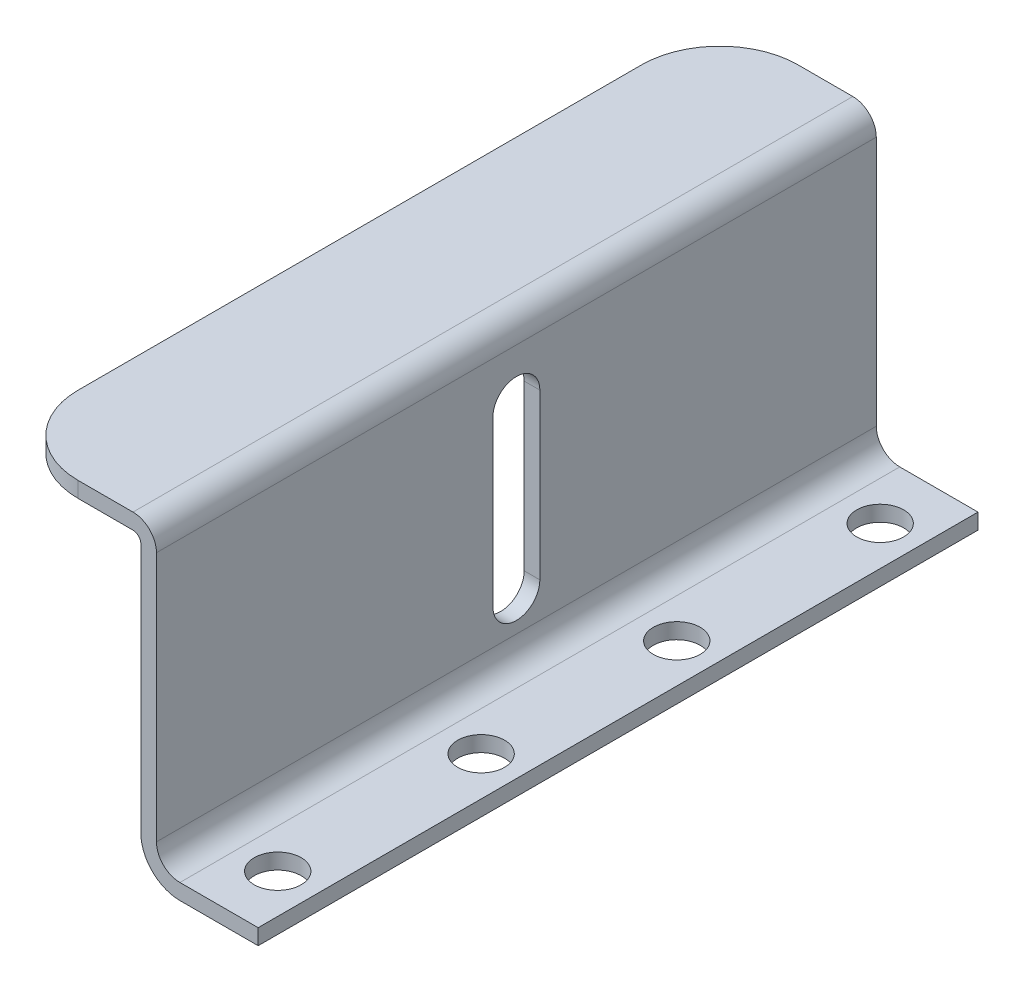
ISO-10303-21;
HEADER;
FILE_DESCRIPTION(('STEP AP214'),'2;1');
FILE_NAME('part.step','',(''),(''),'','','');
FILE_SCHEMA(('AUTOMOTIVE_DESIGN { 1 0 10303 214 1 1 1 1 }'));
ENDSEC;
DATA;
#1=APPLICATION_CONTEXT('core data for automotive mechanical design processes');
#2=APPLICATION_PROTOCOL_DEFINITION('international standard','automotive_design',2000,#1);
#3=PRODUCT_CONTEXT('',#1,'mechanical');
#4=PRODUCT('Part','Part','',(#3));
#5=PRODUCT_RELATED_PRODUCT_CATEGORY('part','',(#4));
#6=PRODUCT_DEFINITION_FORMATION('','',#4);
#7=PRODUCT_DEFINITION_CONTEXT('part definition',#1,'design');
#8=PRODUCT_DEFINITION('design','',#6,#7);
#9=PRODUCT_DEFINITION_SHAPE('','',#8);
#10=(LENGTH_UNIT() NAMED_UNIT(*) SI_UNIT(.MILLI.,.METRE.));
#11=(NAMED_UNIT(*) PLANE_ANGLE_UNIT() SI_UNIT($,.RADIAN.));
#12=(NAMED_UNIT(*) SI_UNIT($,.STERADIAN.) SOLID_ANGLE_UNIT());
#13=UNCERTAINTY_MEASURE_WITH_UNIT(LENGTH_MEASURE(1.E-05),#10,'distance_accuracy_value','');
#14=(GEOMETRIC_REPRESENTATION_CONTEXT(3) GLOBAL_UNCERTAINTY_ASSIGNED_CONTEXT((#13)) GLOBAL_UNIT_ASSIGNED_CONTEXT((#10,
#11,#12)) REPRESENTATION_CONTEXT('',''));
#15=CARTESIAN_POINT('',(0.,0.,0.));
#16=DIRECTION('',(0.,0.,1.));
#17=DIRECTION('',(1.,0.,0.));
#18=AXIS2_PLACEMENT_3D('',#15,#16,#17);
#19=CARTESIAN_POINT('',(7.31554939467241,-17.1473714116764,46.));
#20=DIRECTION('',(0.,1.,0.));
#21=DIRECTION('',(0.,0.,1.));
#22=AXIS2_PLACEMENT_3D('',#19,#20,#21);
#23=PLANE('',#22);
#24=CARTESIAN_POINT('',(12.3155493946724,-17.1473714116764,-38.5));
#25=DIRECTION('',(0.,1.,0.));
#26=DIRECTION('',(0.,0.,1.));
#27=AXIS2_PLACEMENT_3D('',#24,#25,#26);
#28=CIRCLE('',#27,3.);
#29=CARTESIAN_POINT('',(12.3155493946724,-17.1473714116764,-35.5));
#30=VERTEX_POINT('',#29);
#31=EDGE_CURVE('E196',#30,#30,#28,.T.);
#32=ORIENTED_EDGE('',*,*,#31,.T.);
#33=EDGE_LOOP('',(#32));
#34=FACE_BOUND('',#33,.T.);
#35=CARTESIAN_POINT('',(12.3155493946724,-17.1473714116764,-12.5));
#36=DIRECTION('',(0.,1.,0.));
#37=DIRECTION('',(0.,0.,1.));
#38=AXIS2_PLACEMENT_3D('',#35,#36,#37);
#39=CIRCLE('',#38,3.);
#40=CARTESIAN_POINT('',(12.3155493946724,-17.1473714116764,-9.5));
#41=VERTEX_POINT('',#40);
#42=EDGE_CURVE('E202',#41,#41,#39,.T.);
#43=ORIENTED_EDGE('',*,*,#42,.T.);
#44=EDGE_LOOP('',(#43));
#45=FACE_BOUND('',#44,.T.);
#46=CARTESIAN_POINT('',(12.3155493946724,-17.1473714116764,12.5));
#47=DIRECTION('',(0.,1.,0.));
#48=DIRECTION('',(0.,0.,1.));
#49=AXIS2_PLACEMENT_3D('',#46,#47,#48);
#50=CIRCLE('',#49,3.);
#51=CARTESIAN_POINT('',(12.3155493946724,-17.1473714116764,15.5));
#52=VERTEX_POINT('',#51);
#53=EDGE_CURVE('E208',#52,#52,#50,.T.);
#54=ORIENTED_EDGE('',*,*,#53,.T.);
#55=EDGE_LOOP('',(#54));
#56=FACE_BOUND('',#55,.T.);
#57=CARTESIAN_POINT('',(12.3155493946724,-17.1473714116764,38.5));
#58=DIRECTION('',(0.,1.,0.));
#59=DIRECTION('',(0.,0.,1.));
#60=AXIS2_PLACEMENT_3D('',#57,#58,#59);
#61=CIRCLE('',#60,3.);
#62=CARTESIAN_POINT('',(12.3155493946724,-17.1473714116764,41.5));
#63=VERTEX_POINT('',#62);
#64=EDGE_CURVE('E214',#63,#63,#61,.T.);
#65=ORIENTED_EDGE('',*,*,#64,.T.);
#66=EDGE_LOOP('',(#65));
#67=FACE_BOUND('',#66,.T.);
#68=DIRECTION('',(1.,0.,0.));
#69=VECTOR('',#68,1.);
#70=CARTESIAN_POINT('',(7.31554939467241,-17.1473714116764,-46.));
#71=LINE('',#70,#69);
#72=CARTESIAN_POINT('',(7.31554939467241,-17.1473714116764,-46.));
#73=VERTEX_POINT('',#72);
#74=CARTESIAN_POINT('',(17.3155493946724,-17.1473714116764,-46.));
#75=VERTEX_POINT('',#74);
#76=EDGE_CURVE('E217',#73,#75,#71,.T.);
#77=ORIENTED_EDGE('',*,*,#76,.T.);
#78=DIRECTION('',(0.,0.,-1.));
#79=VECTOR('',#78,1.);
#80=CARTESIAN_POINT('',(17.3155493946724,-17.1473714116764,46.));
#81=LINE('',#80,#79);
#82=CARTESIAN_POINT('',(17.3155493946724,-17.1473714116764,46.));
#83=VERTEX_POINT('',#82);
#84=EDGE_CURVE('E299',#83,#75,#81,.T.);
#85=ORIENTED_EDGE('',*,*,#84,.F.);
#86=DIRECTION('',(1.,0.,0.));
#87=VECTOR('',#86,1.);
#88=CARTESIAN_POINT('',(7.31554939467241,-17.1473714116764,46.));
#89=LINE('',#88,#87);
#90=CARTESIAN_POINT('',(7.31554939467241,-17.1473714116764,46.));
#91=VERTEX_POINT('',#90);
#92=EDGE_CURVE('E218',#91,#83,#89,.T.);
#93=ORIENTED_EDGE('',*,*,#92,.F.);
#94=DIRECTION('',(0.,0.,-1.));
#95=VECTOR('',#94,1.);
#96=CARTESIAN_POINT('',(7.31554939467241,-17.1473714116764,46.));
#97=LINE('',#96,#95);
#98=EDGE_CURVE('E246',#91,#73,#97,.T.);
#99=ORIENTED_EDGE('',*,*,#98,.T.);
#100=EDGE_LOOP('',(#77,#85,#93,#99));
#101=FACE_BOUND('',#100,.T.);
#102=ADVANCED_FACE('F32',(#34,#45,#56,#67,#101),#23,.F.);
#103=CARTESIAN_POINT('',(17.3155493946724,-15.1473714116764,46.));
#104=DIRECTION('',(1.,0.,0.));
#105=DIRECTION('',(0.,0.,-1.));
#106=AXIS2_PLACEMENT_3D('',#103,#104,#105);
#107=PLANE('',#106);
#108=DIRECTION('',(0.,-1.,0.));
#109=VECTOR('',#108,1.);
#110=CARTESIAN_POINT('',(17.3155493946724,-15.1473714116764,-46.));
#111=LINE('',#110,#109);
#112=CARTESIAN_POINT('',(17.3155493946724,-15.1473714116764,-46.));
#113=VERTEX_POINT('',#112);
#114=EDGE_CURVE('E249',#113,#75,#111,.T.);
#115=ORIENTED_EDGE('',*,*,#114,.F.);
#116=DIRECTION('',(0.,0.,-1.));
#117=VECTOR('',#116,1.);
#118=CARTESIAN_POINT('',(17.3155493946724,-15.1473714116764,46.));
#119=LINE('',#118,#117);
#120=CARTESIAN_POINT('',(17.3155493946724,-15.1473714116764,46.));
#121=VERTEX_POINT('',#120);
#122=EDGE_CURVE('E297',#121,#113,#119,.T.);
#123=ORIENTED_EDGE('',*,*,#122,.F.);
#124=DIRECTION('',(0.,-1.,0.));
#125=VECTOR('',#124,1.);
#126=CARTESIAN_POINT('',(17.3155493946724,-15.1473714116764,46.));
#127=LINE('',#126,#125);
#128=EDGE_CURVE('E220',#121,#83,#127,.T.);
#129=ORIENTED_EDGE('',*,*,#128,.T.);
#130=ORIENTED_EDGE('',*,*,#84,.T.);
#131=EDGE_LOOP('',(#115,#123,#129,#130));
#132=FACE_BOUND('',#131,.T.);
#133=ADVANCED_FACE('F362',(#132),#107,.T.);
#134=CARTESIAN_POINT('',(7.31554939467241,-15.1473714116764,46.));
#135=DIRECTION('',(0.,1.,0.));
#136=DIRECTION('',(0.,0.,1.));
#137=AXIS2_PLACEMENT_3D('',#134,#135,#136);
#138=PLANE('',#137);
#139=CARTESIAN_POINT('',(12.3155493946724,-15.1473714116764,-38.5));
#140=DIRECTION('',(0.,1.,0.));
#141=DIRECTION('',(0.,0.,1.));
#142=AXIS2_PLACEMENT_3D('',#139,#140,#141);
#143=CIRCLE('',#142,3.);
#144=CARTESIAN_POINT('',(12.3155493946724,-15.1473714116764,-35.5));
#145=VERTEX_POINT('',#144);
#146=EDGE_CURVE('E191',#145,#145,#143,.T.);
#147=ORIENTED_EDGE('',*,*,#146,.F.);
#148=EDGE_LOOP('',(#147));
#149=FACE_BOUND('',#148,.T.);
#150=CARTESIAN_POINT('',(12.3155493946724,-15.1473714116764,-12.5));
#151=DIRECTION('',(0.,1.,0.));
#152=DIRECTION('',(0.,0.,1.));
#153=AXIS2_PLACEMENT_3D('',#150,#151,#152);
#154=CIRCLE('',#153,3.);
#155=CARTESIAN_POINT('',(12.3155493946724,-15.1473714116764,-9.5));
#156=VERTEX_POINT('',#155);
#157=EDGE_CURVE('E199',#156,#156,#154,.T.);
#158=ORIENTED_EDGE('',*,*,#157,.F.);
#159=EDGE_LOOP('',(#158));
#160=FACE_BOUND('',#159,.T.);
#161=CARTESIAN_POINT('',(12.3155493946724,-15.1473714116764,12.5));
#162=DIRECTION('',(0.,1.,0.));
#163=DIRECTION('',(0.,0.,1.));
#164=AXIS2_PLACEMENT_3D('',#161,#162,#163);
#165=CIRCLE('',#164,3.);
#166=CARTESIAN_POINT('',(12.3155493946724,-15.1473714116764,15.5));
#167=VERTEX_POINT('',#166);
#168=EDGE_CURVE('E205',#167,#167,#165,.T.);
#169=ORIENTED_EDGE('',*,*,#168,.F.);
#170=EDGE_LOOP('',(#169));
#171=FACE_BOUND('',#170,.T.);
#172=CARTESIAN_POINT('',(12.3155493946724,-15.1473714116764,38.5));
#173=DIRECTION('',(0.,1.,0.));
#174=DIRECTION('',(0.,0.,1.));
#175=AXIS2_PLACEMENT_3D('',#172,#173,#174);
#176=CIRCLE('',#175,3.);
#177=CARTESIAN_POINT('',(12.3155493946724,-15.1473714116764,41.5));
#178=VERTEX_POINT('',#177);
#179=EDGE_CURVE('E211',#178,#178,#176,.T.);
#180=ORIENTED_EDGE('',*,*,#179,.F.);
#181=EDGE_LOOP('',(#180));
#182=FACE_BOUND('',#181,.T.);
#183=DIRECTION('',(1.,0.,0.));
#184=VECTOR('',#183,1.);
#185=CARTESIAN_POINT('',(7.31554939467241,-15.1473714116764,-46.));
#186=LINE('',#185,#184);
#187=CARTESIAN_POINT('',(7.31554939467241,-15.1473714116764,-46.));
#188=VERTEX_POINT('',#187);
#189=EDGE_CURVE('E252',#188,#113,#186,.T.);
#190=ORIENTED_EDGE('',*,*,#189,.F.);
#191=DIRECTION('',(0.,0.,-1.));
#192=VECTOR('',#191,1.);
#193=CARTESIAN_POINT('',(7.31554939467241,-15.1473714116764,46.));
#194=LINE('',#193,#192);
#195=CARTESIAN_POINT('',(7.31554939467241,-15.1473714116764,46.));
#196=VERTEX_POINT('',#195);
#197=EDGE_CURVE('E295',#196,#188,#194,.T.);
#198=ORIENTED_EDGE('',*,*,#197,.F.);
#199=DIRECTION('',(1.,0.,0.));
#200=VECTOR('',#199,1.);
#201=CARTESIAN_POINT('',(7.31554939467241,-15.1473714116764,46.));
#202=LINE('',#201,#200);
#203=EDGE_CURVE('E224',#196,#121,#202,.T.);
#204=ORIENTED_EDGE('',*,*,#203,.T.);
#205=ORIENTED_EDGE('',*,*,#122,.T.);
#206=EDGE_LOOP('',(#190,#198,#204,#205));
#207=FACE_BOUND('',#206,.T.);
#208=ADVANCED_FACE('F357',(#149,#160,#171,#182,#207),#138,.T.);
#209=CARTESIAN_POINT('',(7.31554939467241,-12.1473714116764,46.));
#210=DIRECTION('',(0.,0.,-1.));
#211=DIRECTION('',(-1.,0.,0.));
#212=AXIS2_PLACEMENT_3D('',#209,#210,#211);
#213=CYLINDRICAL_SURFACE('',#212,3.);
#214=CARTESIAN_POINT('',(7.31554939467241,-12.1473714116764,-46.));
#215=DIRECTION('',(0.,0.,1.));
#216=DIRECTION('',(-1.,0.,0.));
#217=AXIS2_PLACEMENT_3D('',#214,#215,#216);
#218=CIRCLE('',#217,3.);
#219=CARTESIAN_POINT('',(4.31554939467241,-12.1473714116764,-46.));
#220=VERTEX_POINT('',#219);
#221=EDGE_CURVE('E255',#220,#188,#218,.T.);
#222=ORIENTED_EDGE('',*,*,#221,.F.);
#223=DIRECTION('',(0.,0.,-1.));
#224=VECTOR('',#223,1.);
#225=CARTESIAN_POINT('',(4.31554939467241,-12.1473714116764,46.));
#226=LINE('',#225,#224);
#227=CARTESIAN_POINT('',(4.31554939467241,-12.1473714116764,46.));
#228=VERTEX_POINT('',#227);
#229=EDGE_CURVE('E293',#228,#220,#226,.T.);
#230=ORIENTED_EDGE('',*,*,#229,.F.);
#231=CARTESIAN_POINT('',(7.31554939467241,-12.1473714116764,46.));
#232=DIRECTION('',(0.,0.,1.));
#233=DIRECTION('',(-1.,0.,0.));
#234=AXIS2_PLACEMENT_3D('',#231,#232,#233);
#235=CIRCLE('',#234,3.);
#236=EDGE_CURVE('E227',#228,#196,#235,.T.);
#237=ORIENTED_EDGE('',*,*,#236,.T.);
#238=ORIENTED_EDGE('',*,*,#197,.T.);
#239=EDGE_LOOP('',(#222,#230,#237,#238));
#240=FACE_BOUND('',#239,.T.);
#241=ADVANCED_FACE('F353',(#240),#213,.F.);
#242=CARTESIAN_POINT('',(4.3155493946724,19.8526285883236,46.));
#243=DIRECTION('',(1.,0.,0.));
#244=DIRECTION('',(0.,1.,0.));
#245=AXIS2_PLACEMENT_3D('',#242,#243,#244);
#246=PLANE('',#245);
#247=CARTESIAN_POINT('',(4.3155493946724,-7.64737141167641,0.));
#248=DIRECTION('',(1.,0.,0.));
#249=DIRECTION('',(0.,1.,0.));
#250=AXIS2_PLACEMENT_3D('',#247,#248,#249);
#251=CIRCLE('',#250,3.);
#252=CARTESIAN_POINT('',(4.3155493946724,-7.64737141167641,3.));
#253=VERTEX_POINT('',#252);
#254=CARTESIAN_POINT('',(4.3155493946724,-7.6473714116764,-3.));
#255=VERTEX_POINT('',#254);
#256=EDGE_CURVE('E179',#253,#255,#251,.T.);
#257=ORIENTED_EDGE('',*,*,#256,.F.);
#258=DIRECTION('',(0.,-1.,0.));
#259=VECTOR('',#258,1.);
#260=CARTESIAN_POINT('',(4.3155493946724,-7.64737141167641,3.));
#261=LINE('',#260,#259);
#262=CARTESIAN_POINT('',(4.3155493946724,13.3526285883236,3.));
#263=VERTEX_POINT('',#262);
#264=EDGE_CURVE('E184',#263,#253,#261,.T.);
#265=ORIENTED_EDGE('',*,*,#264,.F.);
#266=CARTESIAN_POINT('',(4.3155493946724,13.3526285883236,0.));
#267=DIRECTION('',(1.,0.,0.));
#268=DIRECTION('',(0.,1.,0.));
#269=AXIS2_PLACEMENT_3D('',#266,#267,#268);
#270=CIRCLE('',#269,3.);
#271=CARTESIAN_POINT('',(4.3155493946724,13.3526285883236,-3.));
#272=VERTEX_POINT('',#271);
#273=EDGE_CURVE('E163',#272,#263,#270,.T.);
#274=ORIENTED_EDGE('',*,*,#273,.F.);
#275=DIRECTION('',(0.,1.,0.));
#276=VECTOR('',#275,1.);
#277=CARTESIAN_POINT('',(4.3155493946724,-7.64737141167641,-3.));
#278=LINE('',#277,#276);
#279=EDGE_CURVE('E174',#255,#272,#278,.T.);
#280=ORIENTED_EDGE('',*,*,#279,.F.);
#281=EDGE_LOOP('',(#257,#265,#274,#280));
#282=FACE_BOUND('',#281,.T.);
#283=DIRECTION('',(0.,-1.,0.));
#284=VECTOR('',#283,1.);
#285=CARTESIAN_POINT('',(4.3155493946724,19.8526285883236,-46.));
#286=LINE('',#285,#284);
#287=CARTESIAN_POINT('',(4.3155493946724,19.8526285883236,-46.));
#288=VERTEX_POINT('',#287);
#289=EDGE_CURVE('E258',#288,#220,#286,.T.);
#290=ORIENTED_EDGE('',*,*,#289,.F.);
#291=DIRECTION('',(0.,0.,-1.));
#292=VECTOR('',#291,1.);
#293=CARTESIAN_POINT('',(4.3155493946724,19.8526285883236,46.));
#294=LINE('',#293,#292);
#295=CARTESIAN_POINT('',(4.3155493946724,19.8526285883236,46.));
#296=VERTEX_POINT('',#295);
#297=EDGE_CURVE('E291',#296,#288,#294,.T.);
#298=ORIENTED_EDGE('',*,*,#297,.F.);
#299=DIRECTION('',(0.,-1.,0.));
#300=VECTOR('',#299,1.);
#301=CARTESIAN_POINT('',(4.3155493946724,19.8526285883236,46.));
#302=LINE('',#301,#300);
#303=EDGE_CURVE('E230',#296,#228,#302,.T.);
#304=ORIENTED_EDGE('',*,*,#303,.T.);
#305=ORIENTED_EDGE('',*,*,#229,.T.);
#306=EDGE_LOOP('',(#290,#298,#304,#305));
#307=FACE_BOUND('',#306,.T.);
#308=ADVANCED_FACE('F181',(#282,#307),#246,.T.);
#309=CARTESIAN_POINT('',(1.3155493946724,19.8526285883236,46.));
#310=DIRECTION('',(0.,0.,-1.));
#311=DIRECTION('',(-1.,0.,0.));
#312=AXIS2_PLACEMENT_3D('',#309,#310,#311);
#313=CYLINDRICAL_SURFACE('',#312,3.);
#314=CARTESIAN_POINT('',(1.3155493946724,19.8526285883236,-46.));
#315=DIRECTION('',(0.,0.,-1.));
#316=DIRECTION('',(1.,0.,0.));
#317=AXIS2_PLACEMENT_3D('',#314,#315,#316);
#318=CIRCLE('',#317,3.);
#319=CARTESIAN_POINT('',(1.31554939467238,22.8526285883236,-46.));
#320=VERTEX_POINT('',#319);
#321=EDGE_CURVE('E261',#320,#288,#318,.T.);
#322=ORIENTED_EDGE('',*,*,#321,.F.);
#323=DIRECTION('',(0.,0.,-1.));
#324=VECTOR('',#323,1.);
#325=CARTESIAN_POINT('',(1.31554939467238,22.8526285883236,46.));
#326=LINE('',#325,#324);
#327=CARTESIAN_POINT('',(1.31554939467238,22.8526285883236,46.));
#328=VERTEX_POINT('',#327);
#329=EDGE_CURVE('E288',#328,#320,#326,.T.);
#330=ORIENTED_EDGE('',*,*,#329,.F.);
#331=CARTESIAN_POINT('',(1.3155493946724,19.8526285883236,46.));
#332=DIRECTION('',(0.,0.,-1.));
#333=DIRECTION('',(1.,0.,0.));
#334=AXIS2_PLACEMENT_3D('',#331,#332,#333);
#335=CIRCLE('',#334,3.);
#336=EDGE_CURVE('E233',#328,#296,#335,.T.);
#337=ORIENTED_EDGE('',*,*,#336,.T.);
#338=ORIENTED_EDGE('',*,*,#297,.T.);
#339=EDGE_LOOP('',(#322,#330,#337,#338));
#340=FACE_BOUND('',#339,.T.);
#341=ADVANCED_FACE('F349',(#340),#313,.T.);
#342=CARTESIAN_POINT('',(-15.6844506053276,22.8526285883236,46.));
#343=DIRECTION('',(0.,1.,0.));
#344=DIRECTION('',(-1.,0.,0.));
#345=AXIS2_PLACEMENT_3D('',#342,#343,#344);
#346=PLANE('',#345);
#347=DIRECTION('',(1.,0.,0.));
#348=VECTOR('',#347,1.);
#349=CARTESIAN_POINT('',(-15.6844506053276,22.8526285883236,-46.));
#350=LINE('',#349,#348);
#351=CARTESIAN_POINT('',(-5.6844506053276,22.8526285883236,-46.));
#352=VERTEX_POINT('',#351);
#353=EDGE_CURVE('E264',#352,#320,#350,.T.);
#354=ORIENTED_EDGE('',*,*,#353,.F.);
#355=CARTESIAN_POINT('',(-5.6844506053276,22.8526285883236,-36.));
#356=DIRECTION('',(0.,1.,0.));
#357=DIRECTION('',(-1.,0.,0.));
#358=AXIS2_PLACEMENT_3D('',#355,#356,#357);
#359=CIRCLE('',#358,10.);
#360=CARTESIAN_POINT('',(-15.6844506053276,22.8526285883236,-36.));
#361=VERTEX_POINT('',#360);
#362=EDGE_CURVE('E315',#352,#361,#359,.T.);
#363=ORIENTED_EDGE('',*,*,#362,.T.);
#364=DIRECTION('',(0.,0.,-1.));
#365=VECTOR('',#364,1.);
#366=CARTESIAN_POINT('',(-15.6844506053276,22.8526285883236,46.));
#367=LINE('',#366,#365);
#368=CARTESIAN_POINT('',(-15.6844506053276,22.8526285883236,36.));
#369=VERTEX_POINT('',#368);
#370=EDGE_CURVE('E286',#369,#361,#367,.T.);
#371=ORIENTED_EDGE('',*,*,#370,.F.);
#372=CARTESIAN_POINT('',(-5.6844506053276,22.8526285883236,36.));
#373=DIRECTION('',(0.,1.,0.));
#374=DIRECTION('',(-1.,0.,0.));
#375=AXIS2_PLACEMENT_3D('',#372,#373,#374);
#376=CIRCLE('',#375,10.);
#377=CARTESIAN_POINT('',(-5.6844506053276,22.8526285883236,46.));
#378=VERTEX_POINT('',#377);
#379=EDGE_CURVE('E313',#369,#378,#376,.T.);
#380=ORIENTED_EDGE('',*,*,#379,.T.);
#381=DIRECTION('',(1.,0.,0.));
#382=VECTOR('',#381,1.);
#383=CARTESIAN_POINT('',(-15.6844506053276,22.8526285883236,46.));
#384=LINE('',#383,#382);
#385=EDGE_CURVE('E236',#378,#328,#384,.T.);
#386=ORIENTED_EDGE('',*,*,#385,.T.);
#387=ORIENTED_EDGE('',*,*,#329,.T.);
#388=EDGE_LOOP('',(#354,#363,#371,#380,#386,#387));
#389=FACE_BOUND('',#388,.T.);
#390=ADVANCED_FACE('F337',(#389),#346,.T.);
#391=CARTESIAN_POINT('',(-15.6844506053276,20.8526285883236,46.));
#392=DIRECTION('',(-1.,0.,0.));
#393=DIRECTION('',(0.,0.,1.));
#394=AXIS2_PLACEMENT_3D('',#391,#392,#393);
#395=PLANE('',#394);
#396=ORIENTED_EDGE('',*,*,#370,.T.);
#397=DIRECTION('',(0.,1.,0.));
#398=VECTOR('',#397,1.);
#399=CARTESIAN_POINT('',(-15.6844506053276,20.8526285883236,-36.));
#400=LINE('',#399,#398);
#401=CARTESIAN_POINT('',(-15.6844506053276,20.8526285883236,-36.));
#402=VERTEX_POINT('',#401);
#403=EDGE_CURVE('E53',#361,#402,#400,.F.);
#404=ORIENTED_EDGE('',*,*,#403,.T.);
#405=DIRECTION('',(0.,0.,-1.));
#406=VECTOR('',#405,1.);
#407=CARTESIAN_POINT('',(-15.6844506053276,20.8526285883236,46.));
#408=LINE('',#407,#406);
#409=CARTESIAN_POINT('',(-15.6844506053276,20.8526285883236,36.));
#410=VERTEX_POINT('',#409);
#411=EDGE_CURVE('E284',#410,#402,#408,.T.);
#412=ORIENTED_EDGE('',*,*,#411,.F.);
#413=DIRECTION('',(0.,1.,0.));
#414=VECTOR('',#413,1.);
#415=CARTESIAN_POINT('',(-15.6844506053276,20.8526285883236,36.));
#416=LINE('',#415,#414);
#417=EDGE_CURVE('E317',#410,#369,#416,.T.);
#418=ORIENTED_EDGE('',*,*,#417,.T.);
#419=EDGE_LOOP('',(#396,#404,#412,#418));
#420=FACE_BOUND('',#419,.T.);
#421=ADVANCED_FACE('F338',(#420),#395,.T.);
#422=CARTESIAN_POINT('',(-15.6844506053276,20.8526285883236,46.));
#423=DIRECTION('',(0.,1.,0.));
#424=DIRECTION('',(-1.,0.,0.));
#425=AXIS2_PLACEMENT_3D('',#422,#423,#424);
#426=PLANE('',#425);
#427=ORIENTED_EDGE('',*,*,#411,.T.);
#428=CARTESIAN_POINT('',(-5.6844506053276,20.8526285883236,-36.));
#429=DIRECTION('',(0.,1.,0.));
#430=DIRECTION('',(-1.,0.,0.));
#431=AXIS2_PLACEMENT_3D('',#428,#429,#430);
#432=CIRCLE('',#431,10.);
#433=CARTESIAN_POINT('',(-5.6844506053276,20.8526285883236,-46.));
#434=VERTEX_POINT('',#433);
#435=EDGE_CURVE('E40',#402,#434,#432,.F.);
#436=ORIENTED_EDGE('',*,*,#435,.T.);
#437=DIRECTION('',(1.,0.,0.));
#438=VECTOR('',#437,1.);
#439=CARTESIAN_POINT('',(-15.6844506053276,20.8526285883236,-46.));
#440=LINE('',#439,#438);
#441=CARTESIAN_POINT('',(1.3155493946724,20.8526285883236,-46.));
#442=VERTEX_POINT('',#441);
#443=EDGE_CURVE('E266',#434,#442,#440,.T.);
#444=ORIENTED_EDGE('',*,*,#443,.T.);
#445=DIRECTION('',(0.,0.,-1.));
#446=VECTOR('',#445,1.);
#447=CARTESIAN_POINT('',(1.3155493946724,20.8526285883236,46.));
#448=LINE('',#447,#446);
#449=CARTESIAN_POINT('',(1.3155493946724,20.8526285883236,46.));
#450=VERTEX_POINT('',#449);
#451=EDGE_CURVE('E281',#450,#442,#448,.T.);
#452=ORIENTED_EDGE('',*,*,#451,.F.);
#453=DIRECTION('',(1.,0.,0.));
#454=VECTOR('',#453,1.);
#455=CARTESIAN_POINT('',(-15.6844506053276,20.8526285883236,46.));
#456=LINE('',#455,#454);
#457=CARTESIAN_POINT('',(-5.6844506053276,20.8526285883236,46.));
#458=VERTEX_POINT('',#457);
#459=EDGE_CURVE('E238',#458,#450,#456,.T.);
#460=ORIENTED_EDGE('',*,*,#459,.F.);
#461=CARTESIAN_POINT('',(-5.6844506053276,20.8526285883236,36.));
#462=DIRECTION('',(0.,1.,0.));
#463=DIRECTION('',(-1.,0.,0.));
#464=AXIS2_PLACEMENT_3D('',#461,#462,#463);
#465=CIRCLE('',#464,10.);
#466=EDGE_CURVE('E321',#458,#410,#465,.F.);
#467=ORIENTED_EDGE('',*,*,#466,.T.);
#468=EDGE_LOOP('',(#427,#436,#444,#452,#460,#467));
#469=FACE_BOUND('',#468,.T.);
#470=ADVANCED_FACE('F325',(#469),#426,.F.);
#471=CARTESIAN_POINT('',(1.3155493946724,19.8526285883236,46.));
#472=DIRECTION('',(0.,0.,-1.));
#473=DIRECTION('',(-1.,0.,0.));
#474=AXIS2_PLACEMENT_3D('',#471,#472,#473);
#475=CYLINDRICAL_SURFACE('',#474,1.);
#476=CARTESIAN_POINT('',(1.3155493946724,19.8526285883236,-46.));
#477=DIRECTION('',(0.,0.,1.));
#478=DIRECTION('',(1.,0.,0.));
#479=AXIS2_PLACEMENT_3D('',#476,#477,#478);
#480=CIRCLE('',#479,1.);
#481=CARTESIAN_POINT('',(2.3155493946724,19.8526285883236,-46.));
#482=VERTEX_POINT('',#481);
#483=EDGE_CURVE('E268',#442,#482,#480,.F.);
#484=ORIENTED_EDGE('',*,*,#483,.T.);
#485=DIRECTION('',(0.,0.,-1.));
#486=VECTOR('',#485,1.);
#487=CARTESIAN_POINT('',(2.3155493946724,19.8526285883236,46.));
#488=LINE('',#487,#486);
#489=CARTESIAN_POINT('',(2.3155493946724,19.8526285883236,46.));
#490=VERTEX_POINT('',#489);
#491=EDGE_CURVE('E278',#490,#482,#488,.T.);
#492=ORIENTED_EDGE('',*,*,#491,.F.);
#493=CARTESIAN_POINT('',(1.3155493946724,19.8526285883236,46.));
#494=DIRECTION('',(0.,0.,1.));
#495=DIRECTION('',(1.,0.,0.));
#496=AXIS2_PLACEMENT_3D('',#493,#494,#495);
#497=CIRCLE('',#496,1.);
#498=EDGE_CURVE('E240',#450,#490,#497,.F.);
#499=ORIENTED_EDGE('',*,*,#498,.F.);
#500=ORIENTED_EDGE('',*,*,#451,.T.);
#501=EDGE_LOOP('',(#484,#492,#499,#500));
#502=FACE_BOUND('',#501,.T.);
#503=ADVANCED_FACE('F378',(#502),#475,.F.);
#504=CARTESIAN_POINT('',(2.3155493946724,19.8526285883236,46.));
#505=DIRECTION('',(1.,0.,0.));
#506=DIRECTION('',(0.,1.,0.));
#507=AXIS2_PLACEMENT_3D('',#504,#505,#506);
#508=PLANE('',#507);
#509=DIRECTION('',(0.,-1.,0.));
#510=VECTOR('',#509,1.);
#511=CARTESIAN_POINT('',(2.3155493946724,19.8526285883236,3.));
#512=LINE('',#511,#510);
#513=CARTESIAN_POINT('',(2.3155493946724,13.3526285883236,3.));
#514=VERTEX_POINT('',#513);
#515=CARTESIAN_POINT('',(2.31554939467241,-7.64737141167641,3.));
#516=VERTEX_POINT('',#515);
#517=EDGE_CURVE('E304',#514,#516,#512,.T.);
#518=ORIENTED_EDGE('',*,*,#517,.T.);
#519=CARTESIAN_POINT('',(2.31554939467241,-7.64737141167641,0.));
#520=DIRECTION('',(1.,0.,0.));
#521=DIRECTION('',(0.,1.,0.));
#522=AXIS2_PLACEMENT_3D('',#519,#520,#521);
#523=CIRCLE('',#522,3.);
#524=CARTESIAN_POINT('',(2.31554939467241,-7.64737141167641,-3.));
#525=VERTEX_POINT('',#524);
#526=EDGE_CURVE('E307',#516,#525,#523,.T.);
#527=ORIENTED_EDGE('',*,*,#526,.T.);
#528=DIRECTION('',(0.,1.,0.));
#529=VECTOR('',#528,1.);
#530=CARTESIAN_POINT('',(2.3155493946724,19.8526285883236,-3.));
#531=LINE('',#530,#529);
#532=CARTESIAN_POINT('',(2.3155493946724,13.3526285883236,-3.));
#533=VERTEX_POINT('',#532);
#534=EDGE_CURVE('E301',#525,#533,#531,.T.);
#535=ORIENTED_EDGE('',*,*,#534,.T.);
#536=CARTESIAN_POINT('',(2.3155493946724,13.3526285883236,0.));
#537=DIRECTION('',(1.,0.,0.));
#538=DIRECTION('',(0.,1.,0.));
#539=AXIS2_PLACEMENT_3D('',#536,#537,#538);
#540=CIRCLE('',#539,3.);
#541=EDGE_CURVE('E166',#533,#514,#540,.T.);
#542=ORIENTED_EDGE('',*,*,#541,.T.);
#543=EDGE_LOOP('',(#518,#527,#535,#542));
#544=FACE_BOUND('',#543,.T.);
#545=DIRECTION('',(0.,-1.,0.));
#546=VECTOR('',#545,1.);
#547=CARTESIAN_POINT('',(2.3155493946724,19.8526285883236,-46.));
#548=LINE('',#547,#546);
#549=CARTESIAN_POINT('',(2.31554939467241,-12.1473714116764,-46.));
#550=VERTEX_POINT('',#549);
#551=EDGE_CURVE('E270',#482,#550,#548,.T.);
#552=ORIENTED_EDGE('',*,*,#551,.T.);
#553=DIRECTION('',(0.,0.,-1.));
#554=VECTOR('',#553,1.);
#555=CARTESIAN_POINT('',(2.31554939467241,-12.1473714116764,46.));
#556=LINE('',#555,#554);
#557=CARTESIAN_POINT('',(2.31554939467241,-12.1473714116764,46.));
#558=VERTEX_POINT('',#557);
#559=EDGE_CURVE('E275',#558,#550,#556,.T.);
#560=ORIENTED_EDGE('',*,*,#559,.F.);
#561=DIRECTION('',(0.,-1.,0.));
#562=VECTOR('',#561,1.);
#563=CARTESIAN_POINT('',(2.3155493946724,19.8526285883236,46.));
#564=LINE('',#563,#562);
#565=EDGE_CURVE('E242',#490,#558,#564,.T.);
#566=ORIENTED_EDGE('',*,*,#565,.F.);
#567=ORIENTED_EDGE('',*,*,#491,.T.);
#568=EDGE_LOOP('',(#552,#560,#566,#567));
#569=FACE_BOUND('',#568,.T.);
#570=ADVANCED_FACE('F373',(#544,#569),#508,.F.);
#571=CARTESIAN_POINT('',(7.31554939467241,-12.1473714116764,46.));
#572=DIRECTION('',(0.,0.,-1.));
#573=DIRECTION('',(-1.,0.,0.));
#574=AXIS2_PLACEMENT_3D('',#571,#572,#573);
#575=CYLINDRICAL_SURFACE('',#574,5.);
#576=CARTESIAN_POINT('',(7.31554939467241,-12.1473714116764,-46.));
#577=DIRECTION('',(0.,0.,1.));
#578=DIRECTION('',(1.,0.,0.));
#579=AXIS2_PLACEMENT_3D('',#576,#577,#578);
#580=CIRCLE('',#579,5.);
#581=EDGE_CURVE('E221',#550,#73,#580,.T.);
#582=ORIENTED_EDGE('',*,*,#581,.T.);
#583=ORIENTED_EDGE('',*,*,#98,.F.);
#584=CARTESIAN_POINT('',(7.31554939467241,-12.1473714116764,46.));
#585=DIRECTION('',(0.,0.,1.));
#586=DIRECTION('',(1.,0.,0.));
#587=AXIS2_PLACEMENT_3D('',#584,#585,#586);
#588=CIRCLE('',#587,5.);
#589=EDGE_CURVE('E244',#558,#91,#588,.T.);
#590=ORIENTED_EDGE('',*,*,#589,.F.);
#591=ORIENTED_EDGE('',*,*,#559,.T.);
#592=EDGE_LOOP('',(#582,#583,#590,#591));
#593=FACE_BOUND('',#592,.T.);
#594=ADVANCED_FACE('F370',(#593),#575,.T.);
#595=CARTESIAN_POINT('',(7.31554939467241,-12.1473714116764,46.));
#596=DIRECTION('',(0.,0.,1.));
#597=DIRECTION('',(1.,0.,0.));
#598=AXIS2_PLACEMENT_3D('',#595,#596,#597);
#599=PLANE('',#598);
#600=ORIENTED_EDGE('',*,*,#385,.F.);
#601=DIRECTION('',(0.,1.,0.));
#602=VECTOR('',#601,1.);
#603=CARTESIAN_POINT('',(-5.6844506053276,-12.1473714116764,46.));
#604=LINE('',#603,#602);
#605=EDGE_CURVE('E11',#378,#458,#604,.F.);
#606=ORIENTED_EDGE('',*,*,#605,.T.);
#607=ORIENTED_EDGE('',*,*,#459,.T.);
#608=ORIENTED_EDGE('',*,*,#498,.T.);
#609=ORIENTED_EDGE('',*,*,#565,.T.);
#610=ORIENTED_EDGE('',*,*,#589,.T.);
#611=ORIENTED_EDGE('',*,*,#92,.T.);
#612=ORIENTED_EDGE('',*,*,#128,.F.);
#613=ORIENTED_EDGE('',*,*,#203,.F.);
#614=ORIENTED_EDGE('',*,*,#236,.F.);
#615=ORIENTED_EDGE('',*,*,#303,.F.);
#616=ORIENTED_EDGE('',*,*,#336,.F.);
#617=EDGE_LOOP('',(#600,#606,#607,#608,#609,#610,#611,#612,#613,#614,#615,#616));
#618=FACE_BOUND('',#617,.T.);
#619=ADVANCED_FACE('F344',(#618),#599,.T.);
#620=CARTESIAN_POINT('',(7.31554939467241,-12.1473714116764,-46.));
#621=DIRECTION('',(0.,0.,1.));
#622=DIRECTION('',(1.,0.,0.));
#623=AXIS2_PLACEMENT_3D('',#620,#621,#622);
#624=PLANE('',#623);
#625=ORIENTED_EDGE('',*,*,#443,.F.);
#626=DIRECTION('',(0.,1.,0.));
#627=VECTOR('',#626,1.);
#628=CARTESIAN_POINT('',(-5.6844506053276,22.8526285883236,-46.));
#629=LINE('',#628,#627);
#630=EDGE_CURVE('E310',#434,#352,#629,.T.);
#631=ORIENTED_EDGE('',*,*,#630,.T.);
#632=ORIENTED_EDGE('',*,*,#353,.T.);
#633=ORIENTED_EDGE('',*,*,#321,.T.);
#634=ORIENTED_EDGE('',*,*,#289,.T.);
#635=ORIENTED_EDGE('',*,*,#221,.T.);
#636=ORIENTED_EDGE('',*,*,#189,.T.);
#637=ORIENTED_EDGE('',*,*,#114,.T.);
#638=ORIENTED_EDGE('',*,*,#76,.F.);
#639=ORIENTED_EDGE('',*,*,#581,.F.);
#640=ORIENTED_EDGE('',*,*,#551,.F.);
#641=ORIENTED_EDGE('',*,*,#483,.F.);
#642=EDGE_LOOP('',(#625,#631,#632,#633,#634,#635,#636,#637,#638,#639,#640,#641));
#643=FACE_BOUND('',#642,.T.);
#644=ADVANCED_FACE('F331',(#643),#624,.F.);
#645=CARTESIAN_POINT('',(12.3155493946724,-25.1473714116764,38.5));
#646=DIRECTION('',(0.,1.,0.));
#647=DIRECTION('',(0.,0.,1.));
#648=AXIS2_PLACEMENT_3D('',#645,#646,#647);
#649=CYLINDRICAL_SURFACE('',#648,3.);
#650=ORIENTED_EDGE('',*,*,#179,.T.);
#651=EDGE_LOOP('',(#650));
#652=FACE_BOUND('',#651,.T.);
#653=ORIENTED_EDGE('',*,*,#64,.F.);
#654=EDGE_LOOP('',(#653));
#655=FACE_BOUND('',#654,.T.);
#656=ADVANCED_FACE('F425',(#652,#655),#649,.F.);
#657=CARTESIAN_POINT('',(12.3155493946724,-25.1473714116764,12.5));
#658=DIRECTION('',(0.,1.,0.));
#659=DIRECTION('',(0.,0.,1.));
#660=AXIS2_PLACEMENT_3D('',#657,#658,#659);
#661=CYLINDRICAL_SURFACE('',#660,3.);
#662=ORIENTED_EDGE('',*,*,#168,.T.);
#663=EDGE_LOOP('',(#662));
#664=FACE_BOUND('',#663,.T.);
#665=ORIENTED_EDGE('',*,*,#53,.F.);
#666=EDGE_LOOP('',(#665));
#667=FACE_BOUND('',#666,.T.);
#668=ADVANCED_FACE('F421',(#664,#667),#661,.F.);
#669=CARTESIAN_POINT('',(12.3155493946724,-25.1473714116764,-12.5));
#670=DIRECTION('',(0.,1.,0.));
#671=DIRECTION('',(0.,0.,1.));
#672=AXIS2_PLACEMENT_3D('',#669,#670,#671);
#673=CYLINDRICAL_SURFACE('',#672,3.);
#674=ORIENTED_EDGE('',*,*,#157,.T.);
#675=EDGE_LOOP('',(#674));
#676=FACE_BOUND('',#675,.T.);
#677=ORIENTED_EDGE('',*,*,#42,.F.);
#678=EDGE_LOOP('',(#677));
#679=FACE_BOUND('',#678,.T.);
#680=ADVANCED_FACE('F417',(#676,#679),#673,.F.);
#681=CARTESIAN_POINT('',(12.3155493946724,-25.1473714116764,-38.5));
#682=DIRECTION('',(0.,1.,0.));
#683=DIRECTION('',(0.,0.,1.));
#684=AXIS2_PLACEMENT_3D('',#681,#682,#683);
#685=CYLINDRICAL_SURFACE('',#684,3.);
#686=ORIENTED_EDGE('',*,*,#146,.T.);
#687=EDGE_LOOP('',(#686));
#688=FACE_BOUND('',#687,.T.);
#689=ORIENTED_EDGE('',*,*,#31,.F.);
#690=EDGE_LOOP('',(#689));
#691=FACE_BOUND('',#690,.T.);
#692=ADVANCED_FACE('F413',(#688,#691),#685,.F.);
#693=CARTESIAN_POINT('',(-5.6844506053276,-7.64737141167641,0.));
#694=DIRECTION('',(1.,0.,0.));
#695=DIRECTION('',(0.,1.,0.));
#696=AXIS2_PLACEMENT_3D('',#693,#694,#695);
#697=CYLINDRICAL_SURFACE('',#696,3.);
#698=DIRECTION('',(1.,0.,0.));
#699=VECTOR('',#698,1.);
#700=CARTESIAN_POINT('',(-5.6844506053276,-7.64737141167641,3.));
#701=LINE('',#700,#699);
#702=EDGE_CURVE('E189',#516,#253,#701,.T.);
#703=ORIENTED_EDGE('',*,*,#702,.T.);
#704=ORIENTED_EDGE('',*,*,#256,.T.);
#705=DIRECTION('',(1.,0.,0.));
#706=VECTOR('',#705,1.);
#707=CARTESIAN_POINT('',(-5.6844506053276,-7.64737141167641,-3.));
#708=LINE('',#707,#706);
#709=EDGE_CURVE('E170',#525,#255,#708,.T.);
#710=ORIENTED_EDGE('',*,*,#709,.F.);
#711=ORIENTED_EDGE('',*,*,#526,.F.);
#712=EDGE_LOOP('',(#703,#704,#710,#711));
#713=FACE_BOUND('',#712,.T.);
#714=ADVANCED_FACE('F410',(#713),#697,.F.);
#715=CARTESIAN_POINT('',(-5.6844506053276,-7.64737141167641,3.));
#716=DIRECTION('',(0.,0.,1.));
#717=DIRECTION('',(0.,-1.,0.));
#718=AXIS2_PLACEMENT_3D('',#715,#716,#717);
#719=PLANE('',#718);
#720=DIRECTION('',(1.,0.,0.));
#721=VECTOR('',#720,1.);
#722=CARTESIAN_POINT('',(-5.6844506053276,13.3526285883236,3.));
#723=LINE('',#722,#721);
#724=EDGE_CURVE('E169',#514,#263,#723,.T.);
#725=ORIENTED_EDGE('',*,*,#724,.T.);
#726=ORIENTED_EDGE('',*,*,#264,.T.);
#727=ORIENTED_EDGE('',*,*,#702,.F.);
#728=ORIENTED_EDGE('',*,*,#517,.F.);
#729=EDGE_LOOP('',(#725,#726,#727,#728));
#730=FACE_BOUND('',#729,.T.);
#731=ADVANCED_FACE('F406',(#730),#719,.F.);
#732=CARTESIAN_POINT('',(-5.6844506053276,13.3526285883236,0.));
#733=DIRECTION('',(1.,0.,0.));
#734=DIRECTION('',(0.,1.,0.));
#735=AXIS2_PLACEMENT_3D('',#732,#733,#734);
#736=CYLINDRICAL_SURFACE('',#735,3.);
#737=DIRECTION('',(1.,0.,0.));
#738=VECTOR('',#737,1.);
#739=CARTESIAN_POINT('',(-5.6844506053276,13.3526285883236,-3.));
#740=LINE('',#739,#738);
#741=EDGE_CURVE('E158',#533,#272,#740,.T.);
#742=ORIENTED_EDGE('',*,*,#741,.T.);
#743=ORIENTED_EDGE('',*,*,#273,.T.);
#744=ORIENTED_EDGE('',*,*,#724,.F.);
#745=ORIENTED_EDGE('',*,*,#541,.F.);
#746=EDGE_LOOP('',(#742,#743,#744,#745));
#747=FACE_BOUND('',#746,.T.);
#748=ADVANCED_FACE('F160',(#747),#736,.F.);
#749=CARTESIAN_POINT('',(-5.6844506053276,-7.64737141167641,-3.));
#750=DIRECTION('',(0.,0.,-1.));
#751=DIRECTION('',(0.,1.,0.));
#752=AXIS2_PLACEMENT_3D('',#749,#750,#751);
#753=PLANE('',#752);
#754=ORIENTED_EDGE('',*,*,#709,.T.);
#755=ORIENTED_EDGE('',*,*,#279,.T.);
#756=ORIENTED_EDGE('',*,*,#741,.F.);
#757=ORIENTED_EDGE('',*,*,#534,.F.);
#758=EDGE_LOOP('',(#754,#755,#756,#757));
#759=FACE_BOUND('',#758,.T.);
#760=ADVANCED_FACE('F175',(#759),#753,.F.);
#761=CARTESIAN_POINT('',(-5.6844506053276,-12.1473714116764,-36.));
#762=DIRECTION('',(0.,-1.,0.));
#763=DIRECTION('',(0.,0.,-1.));
#764=AXIS2_PLACEMENT_3D('',#761,#762,#763);
#765=CYLINDRICAL_SURFACE('',#764,10.);
#766=ORIENTED_EDGE('',*,*,#435,.F.);
#767=ORIENTED_EDGE('',*,*,#403,.F.);
#768=ORIENTED_EDGE('',*,*,#362,.F.);
#769=ORIENTED_EDGE('',*,*,#630,.F.);
#770=EDGE_LOOP('',(#766,#767,#768,#769));
#771=FACE_BOUND('',#770,.T.);
#772=ADVANCED_FACE('F334',(#771),#765,.T.);
#773=CARTESIAN_POINT('',(-5.6844506053276,20.8526285883236,36.));
#774=DIRECTION('',(0.,1.,0.));
#775=DIRECTION('',(0.,0.,1.));
#776=AXIS2_PLACEMENT_3D('',#773,#774,#775);
#777=CYLINDRICAL_SURFACE('',#776,10.);
#778=ORIENTED_EDGE('',*,*,#466,.F.);
#779=ORIENTED_EDGE('',*,*,#605,.F.);
#780=ORIENTED_EDGE('',*,*,#379,.F.);
#781=ORIENTED_EDGE('',*,*,#417,.F.);
#782=EDGE_LOOP('',(#778,#779,#780,#781));
#783=FACE_BOUND('',#782,.T.);
#784=ADVANCED_FACE('F34',(#783),#777,.T.);
#785=CLOSED_SHELL('',(#102,#133,#208,#241,#308,#341,#390,#421,#470,#503,#570,#594,#619,#644,
#656,#668,#680,#692,#714,#731,#748,#760,#772,#784));
#786=MANIFOLD_SOLID_BREP('B2',#785);
#787=ADVANCED_BREP_SHAPE_REPRESENTATION('',(#18,#786),#14);
#788=SHAPE_DEFINITION_REPRESENTATION(#9,#787);
ENDSEC;
END-ISO-10303-21;
